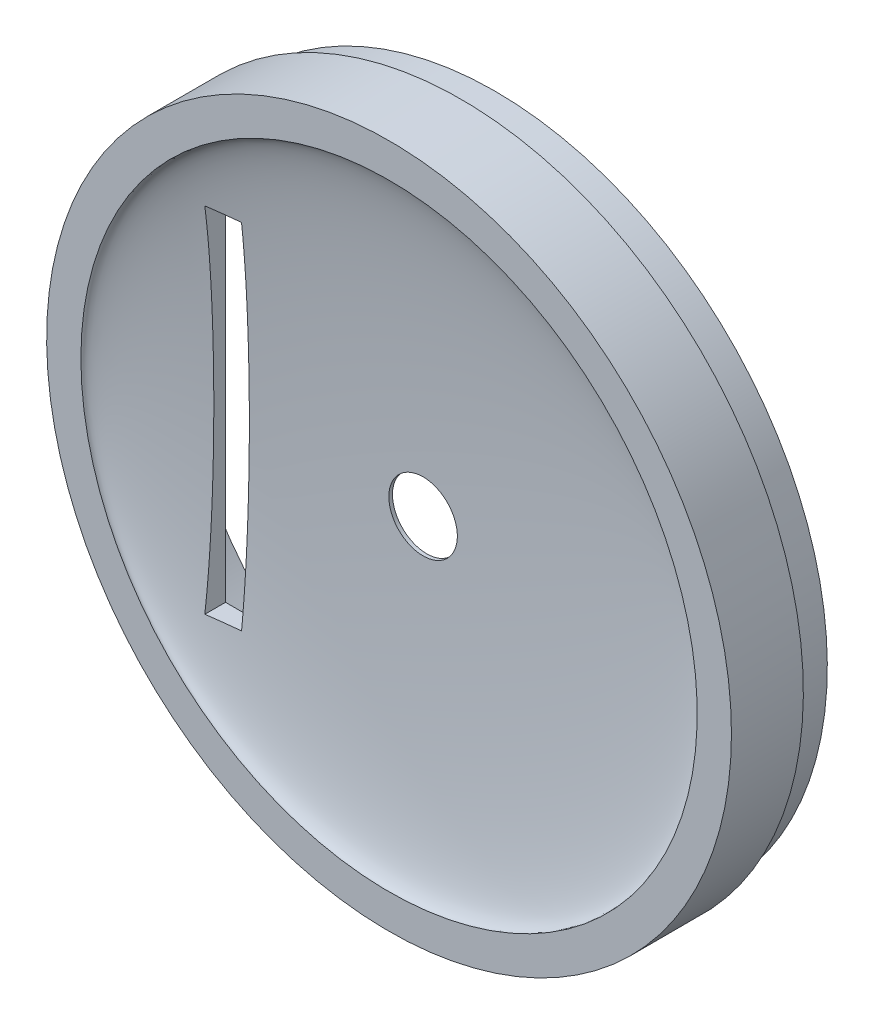
ISO-10303-21;
HEADER;
FILE_DESCRIPTION(('STEP AP214'),'2;1');
FILE_NAME('part.step','',(''),(''),'','','');
FILE_SCHEMA(('AUTOMOTIVE_DESIGN { 1 0 10303 214 1 1 1 1 }'));
ENDSEC;
DATA;
#1=APPLICATION_CONTEXT('core data for automotive mechanical design processes');
#2=APPLICATION_PROTOCOL_DEFINITION('international standard','automotive_design',2000,#1);
#3=PRODUCT_CONTEXT('',#1,'mechanical');
#4=PRODUCT('Part','Part','',(#3));
#5=PRODUCT_RELATED_PRODUCT_CATEGORY('part','',(#4));
#6=PRODUCT_DEFINITION_FORMATION('','',#4);
#7=PRODUCT_DEFINITION_CONTEXT('part definition',#1,'design');
#8=PRODUCT_DEFINITION('design','',#6,#7);
#9=PRODUCT_DEFINITION_SHAPE('','',#8);
#10=(LENGTH_UNIT() NAMED_UNIT(*) SI_UNIT(.MILLI.,.METRE.));
#11=(NAMED_UNIT(*) PLANE_ANGLE_UNIT() SI_UNIT($,.RADIAN.));
#12=(NAMED_UNIT(*) SI_UNIT($,.STERADIAN.) SOLID_ANGLE_UNIT());
#13=UNCERTAINTY_MEASURE_WITH_UNIT(LENGTH_MEASURE(1.E-05),#10,'distance_accuracy_value','');
#14=(GEOMETRIC_REPRESENTATION_CONTEXT(3) GLOBAL_UNCERTAINTY_ASSIGNED_CONTEXT((#13)) GLOBAL_UNIT_ASSIGNED_CONTEXT((#10,
#11,#12)) REPRESENTATION_CONTEXT('',''));
#15=CARTESIAN_POINT('',(0.,0.,0.));
#16=DIRECTION('',(0.,0.,1.));
#17=DIRECTION('',(1.,0.,0.));
#18=AXIS2_PLACEMENT_3D('',#15,#16,#17);
#19=CARTESIAN_POINT('',(0.,0.,10.));
#20=DIRECTION('',(0.,0.,-1.));
#21=DIRECTION('',(-1.,0.,0.));
#22=AXIS2_PLACEMENT_3D('',#19,#20,#21);
#23=CYLINDRICAL_SURFACE('',#22,100.);
#24=CARTESIAN_POINT('',(0.,0.,10.));
#25=DIRECTION('',(0.,0.,1.));
#26=DIRECTION('',(1.,0.,0.));
#27=AXIS2_PLACEMENT_3D('',#24,#25,#26);
#28=CIRCLE('',#27,100.);
#29=CARTESIAN_POINT('',(100.,0.,10.));
#30=VERTEX_POINT('',#29);
#31=EDGE_CURVE('E280',#30,#30,#28,.T.);
#32=ORIENTED_EDGE('',*,*,#31,.F.);
#33=EDGE_LOOP('',(#32));
#34=FACE_BOUND('',#33,.T.);
#35=DIRECTION('',(0.,0.,-1.));
#36=VECTOR('',#35,1.);
#37=CARTESIAN_POINT('',(-14.4359026123636,-98.9525376924026,10.));
#38=LINE('',#37,#36);
#39=CARTESIAN_POINT('',(-14.4359026123636,-98.9525376924026,0.));
#40=VERTEX_POINT('',#39);
#41=CARTESIAN_POINT('',(-14.4359026123636,-98.9525376924026,-11.));
#42=VERTEX_POINT('',#41);
#43=EDGE_CURVE('E167',#40,#42,#38,.T.);
#44=ORIENTED_EDGE('',*,*,#43,.F.);
#45=CARTESIAN_POINT('',(0.,0.,0.));
#46=DIRECTION('',(0.,0.,1.));
#47=DIRECTION('',(1.,0.,0.));
#48=AXIS2_PLACEMENT_3D('',#45,#46,#47);
#49=CIRCLE('',#48,100.);
#50=CARTESIAN_POINT('',(14.4359026123636,-98.9525376924026,0.));
#51=VERTEX_POINT('',#50);
#52=EDGE_CURVE('E11',#40,#51,#49,.T.);
#53=ORIENTED_EDGE('',*,*,#52,.T.);
#54=DIRECTION('',(0.,0.,-1.));
#55=VECTOR('',#54,1.);
#56=CARTESIAN_POINT('',(14.4359026123636,-98.9525376924026,10.));
#57=LINE('',#56,#55);
#58=CARTESIAN_POINT('',(14.4359026123636,-98.9525376924026,-11.));
#59=VERTEX_POINT('',#58);
#60=EDGE_CURVE('E140',#51,#59,#57,.T.);
#61=ORIENTED_EDGE('',*,*,#60,.T.);
#62=CARTESIAN_POINT('',(0.,0.,-11.));
#63=DIRECTION('',(0.,0.,-1.));
#64=DIRECTION('',(-1.,0.,0.));
#65=AXIS2_PLACEMENT_3D('',#62,#63,#64);
#66=CIRCLE('',#65,100.);
#67=EDGE_CURVE('E271',#42,#59,#66,.T.);
#68=ORIENTED_EDGE('',*,*,#67,.F.);
#69=EDGE_LOOP('',(#44,#53,#61,#68));
#70=FACE_BOUND('',#69,.T.);
#71=ADVANCED_FACE('F45',(#34,#70),#23,.T.);
#72=CARTESIAN_POINT('',(0.,0.,-11.));
#73=DIRECTION('',(0.,0.,-1.));
#74=DIRECTION('',(-1.,0.,0.));
#75=AXIS2_PLACEMENT_3D('',#72,#73,#74);
#76=PLANE('',#75);
#77=DIRECTION('',(0.,-1.,0.));
#78=VECTOR('',#77,1.);
#79=CARTESIAN_POINT('',(14.4359026123636,-80.,-11.));
#80=LINE('',#79,#78);
#81=CARTESIAN_POINT('',(14.4359026123636,-95.9197827132983,-11.));
#82=VERTEX_POINT('',#81);
#83=EDGE_CURVE('E154',#82,#59,#80,.T.);
#84=ORIENTED_EDGE('',*,*,#83,.F.);
#85=CARTESIAN_POINT('',(0.,0.,-11.));
#86=DIRECTION('',(0.,0.,-1.));
#87=DIRECTION('',(-1.,0.,0.));
#88=AXIS2_PLACEMENT_3D('',#85,#86,#87);
#89=CIRCLE('',#88,97.);
#90=CARTESIAN_POINT('',(-14.4359026123636,-95.9197827132983,-11.));
#91=VERTEX_POINT('',#90);
#92=EDGE_CURVE('E258',#91,#82,#89,.T.);
#93=ORIENTED_EDGE('',*,*,#92,.F.);
#94=DIRECTION('',(0.,-1.,0.));
#95=VECTOR('',#94,1.);
#96=CARTESIAN_POINT('',(-14.4359026123636,-80.,-11.));
#97=LINE('',#96,#95);
#98=EDGE_CURVE('E158',#91,#42,#97,.T.);
#99=ORIENTED_EDGE('',*,*,#98,.T.);
#100=ORIENTED_EDGE('',*,*,#67,.T.);
#101=EDGE_LOOP('',(#84,#93,#99,#100));
#102=FACE_BOUND('',#101,.T.);
#103=ADVANCED_FACE('F326',(#102),#76,.T.);
#104=CARTESIAN_POINT('',(0.,0.,10.));
#105=DIRECTION('',(0.,0.,1.));
#106=DIRECTION('',(1.,0.,0.));
#107=AXIS2_PLACEMENT_3D('',#104,#105,#106);
#108=PLANE('',#107);
#109=CARTESIAN_POINT('',(0.,0.,10.));
#110=DIRECTION('',(0.,0.,-1.));
#111=DIRECTION('',(-1.,0.,0.));
#112=AXIS2_PLACEMENT_3D('',#109,#110,#111);
#113=CIRCLE('',#112,90.);
#114=CARTESIAN_POINT('',(-90.,0.,10.));
#115=VERTEX_POINT('',#114);
#116=EDGE_CURVE('E274',#115,#115,#113,.T.);
#117=ORIENTED_EDGE('',*,*,#116,.T.);
#118=EDGE_LOOP('',(#117));
#119=FACE_BOUND('',#118,.T.);
#120=ORIENTED_EDGE('',*,*,#31,.T.);
#121=EDGE_LOOP('',(#120));
#122=FACE_BOUND('',#121,.T.);
#123=ADVANCED_FACE('F347',(#119,#122),#108,.T.);
#124=CARTESIAN_POINT('',(0.,0.,10.));
#125=DIRECTION('',(0.,1.,0.));
#126=DIRECTION('',(1.,0.,0.));
#127=AXIS2_PLACEMENT_3D('',#124,#125,#126);
#128=ELLIPSE('',#127,90.,10.);
#129=TRIMMED_CURVE('',#128,(PARAMETER_VALUE(1.5707963267949)),
(PARAMETER_VALUE(4.71238898038469)),.T.,.PARAMETER.);
#130=CARTESIAN_POINT('',(0.,0.,0.));
#131=DIRECTION('',(0.,0.,-1.));
#132=AXIS1_PLACEMENT('',#130,#131);
#133=SURFACE_OF_REVOLUTION('',#129,#132);
#134=CARTESIAN_POINT('',(0.,0.,0.0619201000009364));
#135=DIRECTION('',(0.,0.,-1.));
#136=DIRECTION('',(-1.,0.,0.));
#137=AXIS2_PLACEMENT_3D('',#134,#135,#136);
#138=CIRCLE('',#137,10.);
#139=CARTESIAN_POINT('',(-10.,0.,0.0619201000009364));
#140=VERTEX_POINT('',#139);
#141=EDGE_CURVE('E250',#140,#140,#138,.T.);
#142=ORIENTED_EDGE('',*,*,#141,.T.);
#143=EDGE_LOOP('',(#142));
#144=FACE_BOUND('',#143,.T.);
#145=CARTESIAN_POINT('',(-49.1793243345277,-51.6542578643497,3.9007876419431));
#146=CARTESIAN_POINT('',(-49.5795017056116,-51.6542578643497,3.94062623792774));
#147=CARTESIAN_POINT('',(-49.9795937403267,-51.6542578643497,3.98132791730025));
#148=CARTESIAN_POINT('',(-50.779550749254,-51.6542578643497,4.06456984773545));
#149=CARTESIAN_POINT('',(-51.1794157403766,-51.6542578643497,4.10710993636571));
#150=CARTESIAN_POINT('',(-51.9789063386212,-51.6542578643497,4.19414518839135));
#151=CARTESIAN_POINT('',(-52.3785319598616,-51.6542578643497,4.23864022192712));
#152=CARTESIAN_POINT('',(-53.1775288431545,-51.6542578643497,4.32972260454751));
#153=CARTESIAN_POINT('',(-53.576900114682,-51.6542578643497,4.37630987043403));
#154=CARTESIAN_POINT('',(-54.3753816940261,-51.6542578643497,4.47173440769489));
#155=CARTESIAN_POINT('',(-54.7744919968166,-51.6542578643497,4.52057172118058));
#156=CARTESIAN_POINT('',(-55.5724180148049,-51.6542578643497,4.62067745315383));
#157=CARTESIAN_POINT('',(-55.9712337224205,-51.6542578643497,4.67194593214112));
#158=CARTESIAN_POINT('',(-56.7685434093338,-51.6542578643497,4.77712336705875));
#159=CARTESIAN_POINT('',(-57.1670373665551,-51.6542578643497,4.83103249072346));
#160=CARTESIAN_POINT('',(-57.9636680226766,-51.6542578643497,4.94175178769414));
#161=CARTESIAN_POINT('',(-58.3618046756913,-51.6542578643497,4.99856229088399));
#162=CARTESIAN_POINT('',(-58.7597121919031,-51.6542578643497,5.05694917566588));
#163=B_SPLINE_CURVE_WITH_KNOTS('',3,(#145,#146,#147,#148,#149,#150,#151,#152,#153,#154,#155,
#156,#157,#158,#159,#160,#161,#162),.UNSPECIFIED.,.F.,.F.,(4,2,2,2,2,2,2,2,4),(0.,
1.20646640888192,2.41282643763963,3.61910645324806,4.82533854325134,6.03159321797879,
7.23787792621212,8.44423935754781,9.65073825763686),.UNSPECIFIED.);
#164=CARTESIAN_POINT('',(-49.1793243345276,-51.6542578643497,3.9007876419431));
#165=VERTEX_POINT('',#164);
#166=CARTESIAN_POINT('',(-58.7597121919031,-51.6542578643497,5.05694917566588));
#167=VERTEX_POINT('',#166);
#168=EDGE_CURVE('E233',#165,#167,#163,.T.);
#169=ORIENTED_EDGE('',*,*,#168,.T.);
#170=CARTESIAN_POINT('',(-58.7597121919031,-51.6542578643497,5.05694917566588));
#171=CARTESIAN_POINT('',(-58.7597121919031,-51.2257879948463,5.00167882489663));
#172=CARTESIAN_POINT('',(-58.7597121919031,-50.7971177662914,4.9479830679119));
#173=CARTESIAN_POINT('',(-58.7597121919031,-49.9394273007333,4.84349145819615));
#174=CARTESIAN_POINT('',(-58.7597121919031,-49.5104070666316,4.79269558166795));
#175=CARTESIAN_POINT('',(-58.7597121919031,-48.2230934822,4.64430635189162));
#176=CARTESIAN_POINT('',(-58.7597121919031,-47.3643409263481,4.55068503044203));
#177=CARTESIAN_POINT('',(-58.7597121919031,-45.6459951472869,4.37255569602769));
#178=CARTESIAN_POINT('',(-58.7597121919031,-44.7864020281847,4.28804667076864));
#179=CARTESIAN_POINT('',(-58.7597121919031,-43.0664981206799,4.12702653877879));
#180=CARTESIAN_POINT('',(-58.7597121919031,-42.2061873571042,4.05051516606626));
#181=CARTESIAN_POINT('',(-58.7597121919031,-40.4859690178183,3.90471640398594));
#182=CARTESIAN_POINT('',(-58.7597121919031,-39.6260621461892,3.83542067547597));
#183=CARTESIAN_POINT('',(-58.7597121919031,-37.9057111902261,3.70327674721167));
#184=CARTESIAN_POINT('',(-58.7597121919031,-37.0452670810799,3.64042887145858));
#185=CARTESIAN_POINT('',(-58.7597121919031,-35.3239182547491,3.5206421385934));
#186=CARTESIAN_POINT('',(-58.7597121919031,-34.4630135136488,3.46370362597384));
#187=CARTESIAN_POINT('',(-58.7597121919031,-32.7408138624054,3.35530066496744));
#188=CARTESIAN_POINT('',(-58.7597121919031,-31.879518933591,3.30383651442435));
#189=CARTESIAN_POINT('',(-58.7597121919031,-29.6441191766515,3.17692267716929));
#190=CARTESIAN_POINT('',(-58.7597121919031,-28.269789189514,3.10541950409954));
#191=CARTESIAN_POINT('',(-58.7597121919031,-25.5205581058148,2.97426785292781));
#192=CARTESIAN_POINT('',(-58.7597121919031,-24.1456570049658,2.9146194654893));
#193=CARTESIAN_POINT('',(-58.7597121919031,-21.3953124205989,2.80632525388811));
#194=CARTESIAN_POINT('',(-58.7597121919031,-20.0198689024121,2.75768031296864));
#195=CARTESIAN_POINT('',(-58.7597121919031,-17.2686502389116,2.67076307379931));
#196=CARTESIAN_POINT('',(-58.7597121919031,-15.8928750922681,2.63249081785638));
#197=CARTESIAN_POINT('',(-58.7597121919031,-13.1409818360107,2.56584926337787));
#198=CARTESIAN_POINT('',(-58.7597121919031,-11.7648637083909,2.53748070940699));
#199=CARTESIAN_POINT('',(-58.7597121919031,-9.01246202762552,2.49032793719286));
#200=CARTESIAN_POINT('',(-58.7597121919031,-7.63617847401456,2.47154374657458));
#201=CARTESIAN_POINT('',(-58.7597121919031,-3.50716269549125,2.4292238936095));
#202=CARTESIAN_POINT('',(-58.7597121919031,-0.754275539465007,2.41972119307555));
#203=CARTESIAN_POINT('',(-58.7597121919031,4.75118175118214,2.43766065947616));
#204=CARTESIAN_POINT('',(-58.7597121919031,7.50375189433263,2.46510015492808));
#205=CARTESIAN_POINT('',(-58.7597121919031,11.639042121525,2.53503642693976));
#206=CARTESIAN_POINT('',(-58.7597121919031,13.0220143371993,2.56325168911899));
#207=CARTESIAN_POINT('',(-58.7597121919031,15.7877168947757,2.62968281404779));
#208=CARTESIAN_POINT('',(-58.7597121919031,17.1704472374903,2.66789864253501));
#209=CARTESIAN_POINT('',(-58.7597121919031,19.9354665107374,2.75479104253008));
#210=CARTESIAN_POINT('',(-58.7597121919031,21.3177554681677,2.80346675602345));
#211=CARTESIAN_POINT('',(-58.7597121919031,24.0818958798669,2.9119233135701));
#212=CARTESIAN_POINT('',(-58.7597121919031,25.4637473353769,2.97170412583286));
#213=CARTESIAN_POINT('',(-58.7597121919031,28.2266965246379,3.10322250710228));
#214=CARTESIAN_POINT('',(-58.7597121919031,29.6077943350461,3.17495845805365));
#215=CARTESIAN_POINT('',(-58.7597121919031,32.3692658857683,3.33154566983324));
#216=CARTESIAN_POINT('',(-58.7597121919031,33.7496396181705,3.41639707109605));
#217=CARTESIAN_POINT('',(-58.7597121919031,36.509387994246,3.60077764932815));
#218=CARTESIAN_POINT('',(-58.7597121919031,37.888762654102,3.70030658295743));
#219=CARTESIAN_POINT('',(-58.7597121919031,40.6461715189262,3.91618735839613));
#220=CARTESIAN_POINT('',(-58.7597121919031,42.0242057623637,4.03253870215424));
#221=CARTESIAN_POINT('',(-58.7597121919031,44.0902373689866,4.22207048602785));
#222=CARTESIAN_POINT('',(-58.7597121919031,44.7789243572464,4.28776766317144));
#223=CARTESIAN_POINT('',(-58.7597121919031,46.1557441447154,4.42470455529333));
#224=CARTESIAN_POINT('',(-58.7597121919031,46.8438769479102,4.49594423004647));
#225=CARTESIAN_POINT('',(-58.7597121919031,48.2195437604594,4.64461092083461));
#226=CARTESIAN_POINT('',(-58.7597121919031,48.9070777063626,4.72203852703061));
#227=CARTESIAN_POINT('',(-58.7597121919031,50.2813278958866,4.88396683569426));
#228=CARTESIAN_POINT('',(-58.7597121919031,50.9680441187981,4.96846771358795));
#229=CARTESIAN_POINT('',(-58.7597121919031,51.6542578643497,5.05694917566588));
#230=B_SPLINE_CURVE_WITH_KNOTS('',3,(#170,#171,#172,#173,#174,#175,#176,#177,#178,#179,#180,
#181,#182,#183,#184,#185,#186,#187,#188,#189,#190,#191,#192,#193,#194,#195,#196,#197,#198,#199,
#200,#201,#202,#203,#204,#205,#206,#207,#208,#209,#210,#211,#212,#213,#214,#215,#216,#217,#218,
#219,#220,#221,#222,#223,#224,#225,#226,#227,#228,#229),.UNSPECIFIED.,.F.,.F.,(4,2,2,2,2,2,2,2,
2,2,2,2,2,2,2,2,2,2,2,2,2,2,2,2,2,2,2,2,2,4),(0.,1.29605252492356,2.59209441256618,
5.1835542302742,7.77472586280868,10.3658112920805,12.9538681606152,15.5420550140251,
18.1303926638529,20.7188710654825,24.8473768159193,28.9759141392817,33.1047827415393,
37.2336681839095,41.3628639709038,45.4920716593893,53.7505176021733,62.0083663657866,
66.1581165926872,70.3078526025667,74.4572483433756,78.6066322059052,82.755454929973,
86.9043220809222,91.0531204551968,95.2017960235551,97.2772182561832,99.3526254276596,
101.428230773505,103.503887612237),.UNSPECIFIED.);
#231=CARTESIAN_POINT('',(-58.7597121919031,51.6542578643497,5.05694917566588));
#232=VERTEX_POINT('',#231);
#233=EDGE_CURVE('E241',#167,#232,#230,.T.);
#234=ORIENTED_EDGE('',*,*,#233,.T.);
#235=CARTESIAN_POINT('',(-58.7597121919031,51.6542578643497,5.05694917566588));
#236=CARTESIAN_POINT('',(-58.3618046756914,51.6542578643497,4.998562290884));
#237=CARTESIAN_POINT('',(-57.9636680226766,51.6542578643497,4.94175178769415));
#238=CARTESIAN_POINT('',(-57.1670373665551,51.6542578643497,4.83103249072346));
#239=CARTESIAN_POINT('',(-56.7685434093338,51.6542578643497,4.77712336705875));
#240=CARTESIAN_POINT('',(-55.9712337224206,51.6542578643497,4.67194593214112));
#241=CARTESIAN_POINT('',(-55.5724180148049,51.6542578643497,4.62067745315383));
#242=CARTESIAN_POINT('',(-54.7744919968166,51.6542578643497,4.52057172118058));
#243=CARTESIAN_POINT('',(-54.3753816940261,51.6542578643497,4.47173440769489));
#244=CARTESIAN_POINT('',(-53.576900114682,51.6542578643497,4.37630987043403));
#245=CARTESIAN_POINT('',(-53.1775288431545,51.6542578643497,4.32972260454751));
#246=CARTESIAN_POINT('',(-52.3785319598616,51.6542578643497,4.23864022192712));
#247=CARTESIAN_POINT('',(-51.9789063386212,51.6542578643497,4.19414518839135));
#248=CARTESIAN_POINT('',(-51.1794157403766,51.6542578643497,4.10710993636571));
#249=CARTESIAN_POINT('',(-50.779550749254,51.6542578643497,4.06456984773545));
#250=CARTESIAN_POINT('',(-49.9795937403267,51.6542578643497,3.98132791730025));
#251=CARTESIAN_POINT('',(-49.5795017056115,51.6542578643497,3.94062623792774));
#252=CARTESIAN_POINT('',(-49.1793243345276,51.6542578643497,3.9007876419431));
#253=B_SPLINE_CURVE_WITH_KNOTS('',3,(#235,#236,#237,#238,#239,#240,#241,#242,#243,#244,#245,
#246,#247,#248,#249,#250,#251,#252),.UNSPECIFIED.,.F.,.F.,(4,2,2,2,2,2,2,2,4),(0.,
1.20649890008904,2.41286033142475,3.61914503965809,4.82539971438554,6.03163180438882,
7.23791181999726,8.44427184875498,9.6507382576369),.UNSPECIFIED.);
#254=CARTESIAN_POINT('',(-49.1793243345276,51.6542578643497,3.9007876419431));
#255=VERTEX_POINT('',#254);
#256=EDGE_CURVE('E179',#232,#255,#253,.T.);
#257=ORIENTED_EDGE('',*,*,#256,.T.);
#258=CARTESIAN_POINT('',(-49.1793243345276,51.6542578643497,3.9007876419431));
#259=CARTESIAN_POINT('',(-49.1793243345276,50.8667772918561,3.81847894110055));
#260=CARTESIAN_POINT('',(-49.1793243345276,50.078941025144,3.73962874391423));
#261=CARTESIAN_POINT('',(-49.1793243345276,48.502672579528,3.58822736674554));
#262=CARTESIAN_POINT('',(-49.1793243345276,47.7142404082013,3.51567610798421));
#263=CARTESIAN_POINT('',(-49.1793243345276,46.1370879306914,3.37627132872415));
#264=CARTESIAN_POINT('',(-49.1793243345276,45.3483677589339,3.3094162818509));
#265=CARTESIAN_POINT('',(-49.1793243345276,43.7705018901419,3.18091488775262));
#266=CARTESIAN_POINT('',(-49.1793243345276,42.9813561915682,3.11926855949669));
#267=CARTESIAN_POINT('',(-49.1793243345276,40.6135675810854,2.94154368237196));
#268=CARTESIAN_POINT('',(-49.1793243345276,39.0343811574128,2.8326624796941));
#269=CARTESIAN_POINT('',(-49.1793243345276,35.8750018093766,2.63165958515985));
#270=CARTESIAN_POINT('',(-49.1793243345276,34.2948089162404,2.53953739653505));
#271=CARTESIAN_POINT('',(-49.1793243345276,31.135905187018,2.37044550784574));
#272=CARTESIAN_POINT('',(-49.1793243345276,29.5571955077351,2.29345411012968));
#273=CARTESIAN_POINT('',(-49.1793243345276,26.3990791663961,2.15318431582222));
#274=CARTESIAN_POINT('',(-49.1793243345276,24.8196724693119,2.08990671254811));
#275=CARTESIAN_POINT('',(-49.1793243345276,21.6603028845622,1.97612920452825));
#276=CARTESIAN_POINT('',(-49.1793243345276,20.080339968505,1.92563009150084));
#277=CARTESIAN_POINT('',(-49.1793243345276,16.9199917011441,1.83672439093322));
#278=CARTESIAN_POINT('',(-49.1793243345276,15.339606331822,1.79831844764598));
#279=CARTESIAN_POINT('',(-49.1793243345276,11.9427453315735,1.72824342856436));
#280=CARTESIAN_POINT('',(-49.1793243345276,10.1262312056421,1.69843488103102));
#281=CARTESIAN_POINT('',(-49.1793243345276,6.49301342786076,1.6536582918035));
#282=CARTESIAN_POINT('',(-49.1793243345276,4.67630977518306,1.6386903178903));
#283=CARTESIAN_POINT('',(-49.1793243345276,1.04289220953561,1.62336323201767));
#284=CARTESIAN_POINT('',(-49.1793243345276,-0.773821701701929,1.62300370833962));
#285=CARTESIAN_POINT('',(-49.1793243345276,-4.40719366908001,1.63688651145298));
#286=CARTESIAN_POINT('',(-49.1793243345276,-6.22385172523412,1.65112883466971));
#287=CARTESIAN_POINT('',(-49.1793243345276,-9.85683788003751,1.69443578166664));
#288=CARTESIAN_POINT('',(-49.1793243345276,-11.6731659935985,1.72349915173527));
#289=CARTESIAN_POINT('',(-49.1793243345276,-15.3055138475102,1.79691112769438));
#290=CARTESIAN_POINT('',(-49.1793243345276,-17.1215335883912,1.84125970702328));
#291=CARTESIAN_POINT('',(-49.1793243345276,-20.1509145791979,1.92863212136991));
#292=CARTESIAN_POINT('',(-49.1793243345276,-21.3644051700141,1.96721755484673));
#293=CARTESIAN_POINT('',(-49.1793243345276,-23.7911291031949,2.05187023656755));
#294=CARTESIAN_POINT('',(-49.1793243345276,-25.0043624450681,2.09793749897455));
#295=CARTESIAN_POINT('',(-49.1793243345276,-27.4305164328757,2.19794661800484));
#296=CARTESIAN_POINT('',(-49.1793243345276,-28.6434370758451,2.25188854672613));
#297=CARTESIAN_POINT('',(-49.1793243345276,-31.0689282867246,2.36814626892035));
#298=CARTESIAN_POINT('',(-49.1793243345276,-32.2814988381776,2.43046240684325));
#299=CARTESIAN_POINT('',(-49.1793243345276,-34.7061378245785,2.56409299842082));
#300=CARTESIAN_POINT('',(-49.1793243345276,-35.9182062628294,2.63540739190759));
#301=CARTESIAN_POINT('',(-49.1793243345276,-38.3417039237541,2.78783029120249));
#302=CARTESIAN_POINT('',(-49.1793243345276,-39.5531331590064,2.86893859646749));
#303=CARTESIAN_POINT('',(-49.1793243345276,-41.9756556345329,3.04200040244076));
#304=CARTESIAN_POINT('',(-49.1793243345276,-43.1867486025111,3.13395774610461));
#305=CARTESIAN_POINT('',(-49.1793243345276,-45.0026582088889,3.28102498167955));
#306=CARTESIAN_POINT('',(-49.1793243345276,-45.6078465067775,3.33156987738978));
#307=CARTESIAN_POINT('',(-49.1793243345276,-46.8179417652862,3.43591783616527));
#308=CARTESIAN_POINT('',(-49.1793243345276,-47.4228487264385,3.48972089304153));
#309=CARTESIAN_POINT('',(-49.1793243345276,-48.632392074747,3.60082857928264));
#310=CARTESIAN_POINT('',(-49.1793243345276,-49.2370284354114,3.65813349765451));
#311=CARTESIAN_POINT('',(-49.1793243345276,-50.4459330761158,3.77653922513565));
#312=CARTESIAN_POINT('',(-49.1793243345277,-51.0502013537027,3.83764005927014));
#313=CARTESIAN_POINT('',(-49.1793243345277,-51.6542578643497,3.9007876419431));
#314=B_SPLINE_CURVE_WITH_KNOTS('',3,(#258,#259,#260,#261,#262,#263,#264,#265,#266,#267,#268,
#269,#270,#271,#272,#273,#274,#275,#276,#277,#278,#279,#280,#281,#282,#283,#284,#285,#286,#287,
#288,#289,#290,#291,#292,#293,#294,#295,#296,#297,#298,#299,#300,#301,#302,#303,#304,#305,#306,
#307,#308,#309,#310,#311,#312,#313),.UNSPECIFIED.,.F.,.F.,(4,2,2,2,2,2,2,2,2,2,2,2,2,2,2,2,2,2,
2,2,2,2,2,2,2,2,2,4),(0.,2.37529512072885,4.75056053006848,7.12518744097237,9.49982299941381,
14.2485159756428,18.997068168816,23.7387604077818,28.4807268715774,33.2229870620224,
37.9654998494756,43.4157119707143,48.865948984458,54.3160323908261,59.766114462957,
65.2157355893928,70.6653472459053,74.3076385816995,77.9499368123796,81.5922683929044,
85.2347498365592,88.8772069256212,92.5195894432684,96.163266064511,97.985144960793,
99.8070203964595,101.629046394272,103.451084405387),.UNSPECIFIED.);
#315=EDGE_CURVE('E200',#255,#165,#314,.T.);
#316=ORIENTED_EDGE('',*,*,#315,.T.);
#317=EDGE_LOOP('',(#169,#234,#257,#316));
#318=FACE_BOUND('',#317,.T.);
#319=ORIENTED_EDGE('',*,*,#116,.F.);
#320=EDGE_LOOP('',(#319));
#321=FACE_BOUND('',#320,.T.);
#322=ADVANCED_FACE('F207',(#144,#318,#321),#133,.T.);
#323=CARTESIAN_POINT('',(0.,0.,-21.));
#324=DIRECTION('',(0.,0.,-1.));
#325=DIRECTION('',(-1.,0.,0.));
#326=AXIS2_PLACEMENT_3D('',#323,#324,#325);
#327=PLANE('',#326);
#328=CARTESIAN_POINT('',(0.,0.,-21.));
#329=DIRECTION('',(0.,0.,-1.));
#330=DIRECTION('',(-1.,0.,0.));
#331=AXIS2_PLACEMENT_3D('',#328,#329,#330);
#332=CIRCLE('',#331,97.);
#333=CARTESIAN_POINT('',(-97.,0.,-21.));
#334=VERTEX_POINT('',#333);
#335=EDGE_CURVE('E259',#334,#334,#332,.T.);
#336=ORIENTED_EDGE('',*,*,#335,.T.);
#337=EDGE_LOOP('',(#336));
#338=FACE_BOUND('',#337,.T.);
#339=CARTESIAN_POINT('',(0.,0.,-21.));
#340=DIRECTION('',(0.,0.,-1.));
#341=DIRECTION('',(-1.,0.,0.));
#342=AXIS2_PLACEMENT_3D('',#339,#340,#341);
#343=CIRCLE('',#342,95.);
#344=CARTESIAN_POINT('',(-95.,0.,-21.));
#345=VERTEX_POINT('',#344);
#346=EDGE_CURVE('E254',#345,#345,#343,.T.);
#347=ORIENTED_EDGE('',*,*,#346,.F.);
#348=EDGE_LOOP('',(#347));
#349=FACE_BOUND('',#348,.T.);
#350=ADVANCED_FACE('F231',(#338,#349),#327,.T.);
#351=CARTESIAN_POINT('',(0.,0.,-21.));
#352=DIRECTION('',(0.,0.,1.));
#353=DIRECTION('',(1.,0.,0.));
#354=AXIS2_PLACEMENT_3D('',#351,#352,#353);
#355=CYLINDRICAL_SURFACE('',#354,97.);
#356=ORIENTED_EDGE('',*,*,#335,.F.);
#357=EDGE_LOOP('',(#356));
#358=FACE_BOUND('',#357,.T.);
#359=EDGE_CURVE('E264',#82,#91,#89,.T.);
#360=ORIENTED_EDGE('',*,*,#359,.T.);
#361=ORIENTED_EDGE('',*,*,#92,.T.);
#362=EDGE_LOOP('',(#360,#361));
#363=FACE_BOUND('',#362,.T.);
#364=ADVANCED_FACE('F329',(#358,#363),#355,.T.);
#365=CARTESIAN_POINT('',(0.,0.,-1.));
#366=DIRECTION('',(0.,0.,1.));
#367=DIRECTION('',(1.,0.,0.));
#368=AXIS2_PLACEMENT_3D('',#365,#366,#367);
#369=PLANE('',#368);
#370=CARTESIAN_POINT('',(0.,0.,-1.));
#371=DIRECTION('',(0.,0.,1.));
#372=DIRECTION('',(1.,0.,0.));
#373=AXIS2_PLACEMENT_3D('',#370,#371,#372);
#374=CIRCLE('',#373,10.);
#375=CARTESIAN_POINT('',(10.,0.,-1.));
#376=VERTEX_POINT('',#375);
#377=EDGE_CURVE('E249',#376,#376,#374,.T.);
#378=ORIENTED_EDGE('',*,*,#377,.T.);
#379=EDGE_LOOP('',(#378));
#380=FACE_BOUND('',#379,.T.);
#381=DIRECTION('',(-1.,0.,0.));
#382=VECTOR('',#381,1.);
#383=CARTESIAN_POINT('',(0.,51.6542578643497,-1.));
#384=LINE('',#383,#382);
#385=CARTESIAN_POINT('',(-49.1793243345276,51.6542578643497,-1.));
#386=VERTEX_POINT('',#385);
#387=CARTESIAN_POINT('',(-58.7597121919031,51.6542578643497,-1.));
#388=VERTEX_POINT('',#387);
#389=EDGE_CURVE('E284',#386,#388,#384,.T.);
#390=ORIENTED_EDGE('',*,*,#389,.T.);
#391=DIRECTION('',(0.,-1.,0.));
#392=VECTOR('',#391,1.);
#393=CARTESIAN_POINT('',(-58.7597121919031,0.,-1.));
#394=LINE('',#393,#392);
#395=CARTESIAN_POINT('',(-58.7597121919031,-51.6542578643497,-1.));
#396=VERTEX_POINT('',#395);
#397=EDGE_CURVE('E296',#388,#396,#394,.T.);
#398=ORIENTED_EDGE('',*,*,#397,.T.);
#399=DIRECTION('',(1.,0.,0.));
#400=VECTOR('',#399,1.);
#401=CARTESIAN_POINT('',(0.,-51.6542578643497,-1.));
#402=LINE('',#401,#400);
#403=CARTESIAN_POINT('',(-49.1793243345276,-51.6542578643497,-1.));
#404=VERTEX_POINT('',#403);
#405=EDGE_CURVE('E292',#396,#404,#402,.T.);
#406=ORIENTED_EDGE('',*,*,#405,.T.);
#407=DIRECTION('',(0.,1.,0.));
#408=VECTOR('',#407,1.);
#409=CARTESIAN_POINT('',(-49.1793243345276,0.,-1.));
#410=LINE('',#409,#408);
#411=EDGE_CURVE('E288',#404,#386,#410,.T.);
#412=ORIENTED_EDGE('',*,*,#411,.T.);
#413=EDGE_LOOP('',(#390,#398,#406,#412));
#414=FACE_BOUND('',#413,.T.);
#415=CARTESIAN_POINT('',(0.,0.,-1.));
#416=DIRECTION('',(0.,0.,-1.));
#417=DIRECTION('',(-1.,0.,0.));
#418=AXIS2_PLACEMENT_3D('',#415,#416,#417);
#419=CIRCLE('',#418,95.);
#420=CARTESIAN_POINT('',(-14.4359026123636,-93.8967769189463,-0.999999999999999));
#421=VERTEX_POINT('',#420);
#422=CARTESIAN_POINT('',(14.4359026123636,-93.8967769189463,-0.999999999999999));
#423=VERTEX_POINT('',#422);
#424=EDGE_CURVE('E263',#421,#423,#419,.T.);
#425=ORIENTED_EDGE('',*,*,#424,.T.);
#426=DIRECTION('',(0.,1.,0.));
#427=VECTOR('',#426,1.);
#428=CARTESIAN_POINT('',(14.4359026123636,0.,-1.));
#429=LINE('',#428,#427);
#430=CARTESIAN_POINT('',(14.4359026123636,-80.,-1.));
#431=VERTEX_POINT('',#430);
#432=EDGE_CURVE('E170',#423,#431,#429,.T.);
#433=ORIENTED_EDGE('',*,*,#432,.T.);
#434=DIRECTION('',(1.,0.,0.));
#435=VECTOR('',#434,1.);
#436=CARTESIAN_POINT('',(0.,-80.,-1.));
#437=LINE('',#436,#435);
#438=CARTESIAN_POINT('',(-14.4359026123636,-80.,-1.));
#439=VERTEX_POINT('',#438);
#440=EDGE_CURVE('E53',#439,#431,#437,.T.);
#441=ORIENTED_EDGE('',*,*,#440,.F.);
#442=DIRECTION('',(0.,1.,0.));
#443=VECTOR('',#442,1.);
#444=CARTESIAN_POINT('',(-14.4359026123636,0.,-1.));
#445=LINE('',#444,#443);
#446=EDGE_CURVE('E164',#421,#439,#445,.T.);
#447=ORIENTED_EDGE('',*,*,#446,.F.);
#448=EDGE_LOOP('',(#425,#433,#441,#447));
#449=FACE_BOUND('',#448,.T.);
#450=ADVANCED_FACE('F353',(#380,#414,#449),#369,.F.);
#451=CARTESIAN_POINT('',(0.,0.,-11.));
#452=DIRECTION('',(0.,0.,1.));
#453=DIRECTION('',(1.,0.,0.));
#454=AXIS2_PLACEMENT_3D('',#451,#452,#453);
#455=CYLINDRICAL_SURFACE('',#454,95.);
#456=DIRECTION('',(0.,0.,1.));
#457=VECTOR('',#456,1.);
#458=CARTESIAN_POINT('',(14.4359026123636,-93.8967769189463,-11.));
#459=LINE('',#458,#457);
#460=CARTESIAN_POINT('',(14.4359026123636,-93.8967769189463,-11.));
#461=VERTEX_POINT('',#460);
#462=EDGE_CURVE('E311',#423,#461,#459,.F.);
#463=ORIENTED_EDGE('',*,*,#462,.F.);
#464=ORIENTED_EDGE('',*,*,#424,.F.);
#465=DIRECTION('',(0.,0.,1.));
#466=VECTOR('',#465,1.);
#467=CARTESIAN_POINT('',(-14.4359026123636,-93.8967769189463,-11.));
#468=LINE('',#467,#466);
#469=CARTESIAN_POINT('',(-14.4359026123636,-93.8967769189463,-11.));
#470=VERTEX_POINT('',#469);
#471=EDGE_CURVE('E300',#421,#470,#468,.F.);
#472=ORIENTED_EDGE('',*,*,#471,.T.);
#473=CARTESIAN_POINT('',(0.,0.,-11.));
#474=DIRECTION('',(0.,0.,1.));
#475=DIRECTION('',(1.,0.,0.));
#476=AXIS2_PLACEMENT_3D('',#473,#474,#475);
#477=CIRCLE('',#476,95.);
#478=EDGE_CURVE('E307',#470,#461,#477,.T.);
#479=ORIENTED_EDGE('',*,*,#478,.T.);
#480=EDGE_LOOP('',(#463,#464,#472,#479));
#481=FACE_BOUND('',#480,.T.);
#482=ORIENTED_EDGE('',*,*,#346,.T.);
#483=EDGE_LOOP('',(#482));
#484=FACE_BOUND('',#483,.T.);
#485=ADVANCED_FACE('F356',(#481,#484),#455,.F.);
#486=CARTESIAN_POINT('',(-58.7597121919031,-51.6542578643497,9.));
#487=DIRECTION('',(-1.,0.,0.));
#488=DIRECTION('',(0.,0.,1.));
#489=AXIS2_PLACEMENT_3D('',#486,#487,#488);
#490=PLANE('',#489);
#491=DIRECTION('',(0.,0.,-1.));
#492=VECTOR('',#491,1.);
#493=CARTESIAN_POINT('',(-58.7597121919031,-51.6542578643497,9.));
#494=LINE('',#493,#492);
#495=EDGE_CURVE('E175',#167,#396,#494,.T.);
#496=ORIENTED_EDGE('',*,*,#495,.T.);
#497=ORIENTED_EDGE('',*,*,#397,.F.);
#498=DIRECTION('',(0.,0.,-1.));
#499=VECTOR('',#498,1.);
#500=CARTESIAN_POINT('',(-58.7597121919031,51.6542578643497,9.));
#501=LINE('',#500,#499);
#502=EDGE_CURVE('E176',#232,#388,#501,.T.);
#503=ORIENTED_EDGE('',*,*,#502,.F.);
#504=ORIENTED_EDGE('',*,*,#233,.F.);
#505=EDGE_LOOP('',(#496,#497,#503,#504));
#506=FACE_BOUND('',#505,.T.);
#507=ADVANCED_FACE('F219',(#506),#490,.F.);
#508=CARTESIAN_POINT('',(-49.1793243345276,-51.6542578643497,9.));
#509=DIRECTION('',(0.,-1.,0.));
#510=DIRECTION('',(0.,0.,-1.));
#511=AXIS2_PLACEMENT_3D('',#508,#509,#510);
#512=PLANE('',#511);
#513=DIRECTION('',(0.,0.,-1.));
#514=VECTOR('',#513,1.);
#515=CARTESIAN_POINT('',(-49.1793243345276,-51.6542578643497,9.));
#516=LINE('',#515,#514);
#517=EDGE_CURVE('E184',#165,#404,#516,.T.);
#518=ORIENTED_EDGE('',*,*,#517,.T.);
#519=ORIENTED_EDGE('',*,*,#405,.F.);
#520=ORIENTED_EDGE('',*,*,#495,.F.);
#521=ORIENTED_EDGE('',*,*,#168,.F.);
#522=EDGE_LOOP('',(#518,#519,#520,#521));
#523=FACE_BOUND('',#522,.T.);
#524=ADVANCED_FACE('F225',(#523),#512,.F.);
#525=CARTESIAN_POINT('',(-49.1793243345276,-51.6542578643497,9.));
#526=DIRECTION('',(1.,0.,0.));
#527=DIRECTION('',(0.,0.,-1.));
#528=AXIS2_PLACEMENT_3D('',#525,#526,#527);
#529=PLANE('',#528);
#530=DIRECTION('',(0.,0.,-1.));
#531=VECTOR('',#530,1.);
#532=CARTESIAN_POINT('',(-49.1793243345276,51.6542578643497,9.));
#533=LINE('',#532,#531);
#534=EDGE_CURVE('E180',#255,#386,#533,.T.);
#535=ORIENTED_EDGE('',*,*,#534,.T.);
#536=ORIENTED_EDGE('',*,*,#411,.F.);
#537=ORIENTED_EDGE('',*,*,#517,.F.);
#538=ORIENTED_EDGE('',*,*,#315,.F.);
#539=EDGE_LOOP('',(#535,#536,#537,#538));
#540=FACE_BOUND('',#539,.T.);
#541=ADVANCED_FACE('F217',(#540),#529,.F.);
#542=CARTESIAN_POINT('',(-49.1793243345276,51.6542578643497,9.));
#543=DIRECTION('',(0.,1.,0.));
#544=DIRECTION('',(0.,0.,1.));
#545=AXIS2_PLACEMENT_3D('',#542,#543,#544);
#546=PLANE('',#545);
#547=ORIENTED_EDGE('',*,*,#502,.T.);
#548=ORIENTED_EDGE('',*,*,#389,.F.);
#549=ORIENTED_EDGE('',*,*,#534,.F.);
#550=ORIENTED_EDGE('',*,*,#256,.F.);
#551=EDGE_LOOP('',(#547,#548,#549,#550));
#552=FACE_BOUND('',#551,.T.);
#553=ADVANCED_FACE('F212',(#552),#546,.F.);
#554=CARTESIAN_POINT('',(0.,0.,9.));
#555=DIRECTION('',(0.,0.,-1.));
#556=DIRECTION('',(-1.,0.,0.));
#557=AXIS2_PLACEMENT_3D('',#554,#555,#556);
#558=CYLINDRICAL_SURFACE('',#557,10.);
#559=ORIENTED_EDGE('',*,*,#377,.F.);
#560=EDGE_LOOP('',(#559));
#561=FACE_BOUND('',#560,.T.);
#562=ORIENTED_EDGE('',*,*,#141,.F.);
#563=EDGE_LOOP('',(#562));
#564=FACE_BOUND('',#563,.T.);
#565=ADVANCED_FACE('F216',(#561,#564),#558,.F.);
#566=CARTESIAN_POINT('',(0.,-80.,0.));
#567=DIRECTION('',(0.,0.,1.));
#568=DIRECTION('',(1.,0.,0.));
#569=AXIS2_PLACEMENT_3D('',#566,#567,#568);
#570=PLANE('',#569);
#571=DIRECTION('',(0.,-1.,0.));
#572=VECTOR('',#571,1.);
#573=CARTESIAN_POINT('',(-14.4359026123636,-80.,0.));
#574=LINE('',#573,#572);
#575=CARTESIAN_POINT('',(-14.4359026123636,-80.,0.));
#576=VERTEX_POINT('',#575);
#577=EDGE_CURVE('E143',#576,#40,#574,.T.);
#578=ORIENTED_EDGE('',*,*,#577,.F.);
#579=DIRECTION('',(-1.,0.,0.));
#580=VECTOR('',#579,1.);
#581=CARTESIAN_POINT('',(0.,-80.,0.));
#582=LINE('',#581,#580);
#583=CARTESIAN_POINT('',(14.4359026123636,-80.,0.));
#584=VERTEX_POINT('',#583);
#585=EDGE_CURVE('E130',#584,#576,#582,.T.);
#586=ORIENTED_EDGE('',*,*,#585,.F.);
#587=DIRECTION('',(0.,-1.,0.));
#588=VECTOR('',#587,1.);
#589=CARTESIAN_POINT('',(14.4359026123636,-80.,0.));
#590=LINE('',#589,#588);
#591=EDGE_CURVE('E137',#584,#51,#590,.T.);
#592=ORIENTED_EDGE('',*,*,#591,.T.);
#593=ORIENTED_EDGE('',*,*,#52,.F.);
#594=EDGE_LOOP('',(#578,#586,#592,#593));
#595=FACE_BOUND('',#594,.T.);
#596=ADVANCED_FACE('F147',(#595),#570,.F.);
#597=CARTESIAN_POINT('',(0.,-80.,0.));
#598=DIRECTION('',(0.,-1.,0.));
#599=DIRECTION('',(0.,0.,-1.));
#600=AXIS2_PLACEMENT_3D('',#597,#598,#599);
#601=PLANE('',#600);
#602=ORIENTED_EDGE('',*,*,#440,.T.);
#603=DIRECTION('',(0.,0.,1.));
#604=VECTOR('',#603,1.);
#605=CARTESIAN_POINT('',(14.4359026123636,-80.,0.));
#606=LINE('',#605,#604);
#607=EDGE_CURVE('E125',#431,#584,#606,.T.);
#608=ORIENTED_EDGE('',*,*,#607,.T.);
#609=ORIENTED_EDGE('',*,*,#585,.T.);
#610=DIRECTION('',(0.,0.,1.));
#611=VECTOR('',#610,1.);
#612=CARTESIAN_POINT('',(-14.4359026123636,-80.,0.));
#613=LINE('',#612,#611);
#614=EDGE_CURVE('E144',#439,#576,#613,.T.);
#615=ORIENTED_EDGE('',*,*,#614,.F.);
#616=EDGE_LOOP('',(#602,#608,#609,#615));
#617=FACE_BOUND('',#616,.T.);
#618=ADVANCED_FACE('F127',(#617),#601,.T.);
#619=CARTESIAN_POINT('',(14.4359026123636,-80.,0.));
#620=DIRECTION('',(1.,0.,0.));
#621=DIRECTION('',(0.,1.,0.));
#622=AXIS2_PLACEMENT_3D('',#619,#620,#621);
#623=PLANE('',#622);
#624=ORIENTED_EDGE('',*,*,#591,.F.);
#625=ORIENTED_EDGE('',*,*,#607,.F.);
#626=ORIENTED_EDGE('',*,*,#432,.F.);
#627=ORIENTED_EDGE('',*,*,#462,.T.);
#628=EDGE_CURVE('E157',#461,#82,#80,.T.);
#629=ORIENTED_EDGE('',*,*,#628,.T.);
#630=ORIENTED_EDGE('',*,*,#83,.T.);
#631=ORIENTED_EDGE('',*,*,#60,.F.);
#632=EDGE_LOOP('',(#624,#625,#626,#627,#629,#630,#631));
#633=FACE_BOUND('',#632,.T.);
#634=ADVANCED_FACE('F138',(#633),#623,.F.);
#635=CARTESIAN_POINT('',(0.,-80.,-11.));
#636=DIRECTION('',(0.,0.,1.));
#637=DIRECTION('',(1.,0.,0.));
#638=AXIS2_PLACEMENT_3D('',#635,#636,#637);
#639=PLANE('',#638);
#640=ORIENTED_EDGE('',*,*,#359,.F.);
#641=ORIENTED_EDGE('',*,*,#628,.F.);
#642=ORIENTED_EDGE('',*,*,#478,.F.);
#643=EDGE_CURVE('E60',#470,#91,#97,.T.);
#644=ORIENTED_EDGE('',*,*,#643,.T.);
#645=EDGE_LOOP('',(#640,#641,#642,#644));
#646=FACE_BOUND('',#645,.T.);
#647=ADVANCED_FACE('F330',(#646),#639,.T.);
#648=CARTESIAN_POINT('',(-14.4359026123636,-80.,0.));
#649=DIRECTION('',(1.,0.,0.));
#650=DIRECTION('',(0.,1.,0.));
#651=AXIS2_PLACEMENT_3D('',#648,#649,#650);
#652=PLANE('',#651);
#653=ORIENTED_EDGE('',*,*,#43,.T.);
#654=ORIENTED_EDGE('',*,*,#98,.F.);
#655=ORIENTED_EDGE('',*,*,#643,.F.);
#656=ORIENTED_EDGE('',*,*,#471,.F.);
#657=ORIENTED_EDGE('',*,*,#446,.T.);
#658=ORIENTED_EDGE('',*,*,#614,.T.);
#659=ORIENTED_EDGE('',*,*,#577,.T.);
#660=EDGE_LOOP('',(#653,#654,#655,#656,#657,#658,#659));
#661=FACE_BOUND('',#660,.T.);
#662=ADVANCED_FACE('F332',(#661),#652,.T.);
#663=CLOSED_SHELL('',(#71,#103,#123,#322,#350,#364,#450,#485,#507,#524,#541,#553,#565,#596,#618,
#634,#647,#662));
#664=MANIFOLD_SOLID_BREP('B2',#663);
#665=ADVANCED_BREP_SHAPE_REPRESENTATION('',(#18,#664),#14);
#666=SHAPE_DEFINITION_REPRESENTATION(#9,#665);
ENDSEC;
END-ISO-10303-21;
